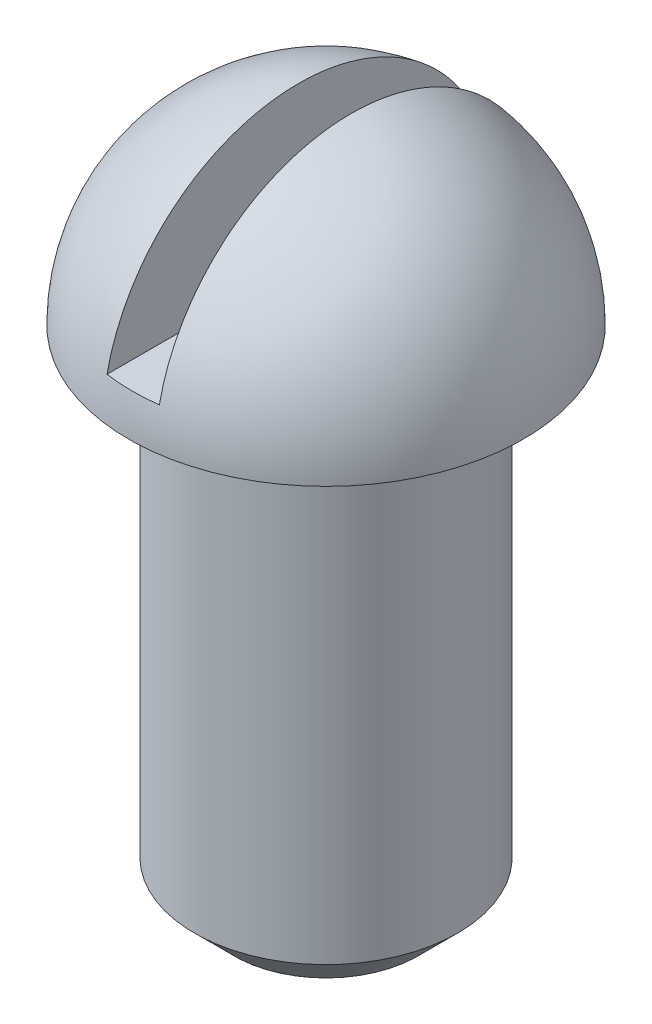
ISO-10303-21;
HEADER;
FILE_DESCRIPTION(('STEP AP214'),'2;1');
FILE_NAME('part.step','',(''),(''),'','','');
FILE_SCHEMA(('AUTOMOTIVE_DESIGN { 1 0 10303 214 1 1 1 1 }'));
ENDSEC;
DATA;
#1=APPLICATION_CONTEXT('core data for automotive mechanical design processes');
#2=APPLICATION_PROTOCOL_DEFINITION('international standard','automotive_design',2000,#1);
#3=PRODUCT_CONTEXT('',#1,'mechanical');
#4=PRODUCT('Part','Part','',(#3));
#5=PRODUCT_RELATED_PRODUCT_CATEGORY('part','',(#4));
#6=PRODUCT_DEFINITION_FORMATION('','',#4);
#7=PRODUCT_DEFINITION_CONTEXT('part definition',#1,'design');
#8=PRODUCT_DEFINITION('design','',#6,#7);
#9=PRODUCT_DEFINITION_SHAPE('','',#8);
#10=(LENGTH_UNIT() NAMED_UNIT(*) SI_UNIT(.MILLI.,.METRE.));
#11=(NAMED_UNIT(*) PLANE_ANGLE_UNIT() SI_UNIT($,.RADIAN.));
#12=(NAMED_UNIT(*) SI_UNIT($,.STERADIAN.) SOLID_ANGLE_UNIT());
#13=UNCERTAINTY_MEASURE_WITH_UNIT(LENGTH_MEASURE(1.E-05),#10,'distance_accuracy_value','');
#14=(GEOMETRIC_REPRESENTATION_CONTEXT(3) GLOBAL_UNCERTAINTY_ASSIGNED_CONTEXT((#13)) GLOBAL_UNIT_ASSIGNED_CONTEXT((#10,
#11,#12)) REPRESENTATION_CONTEXT('',''));
#15=CARTESIAN_POINT('',(0.,0.,0.));
#16=DIRECTION('',(0.,0.,1.));
#17=DIRECTION('',(1.,0.,0.));
#18=AXIS2_PLACEMENT_3D('',#15,#16,#17);
#19=CARTESIAN_POINT('',(-7.,0.,0.));
#20=DIRECTION('',(0.,1.,0.));
#21=DIRECTION('',(0.,0.,1.));
#22=AXIS2_PLACEMENT_3D('',#19,#20,#21);
#23=PLANE('',#22);
#24=CARTESIAN_POINT('',(0.,0.,0.));
#25=DIRECTION('',(0.,-1.,0.));
#26=DIRECTION('',(0.,0.,-1.));
#27=AXIS2_PLACEMENT_3D('',#24,#25,#26);
#28=CIRCLE('',#27,7.);
#29=CARTESIAN_POINT('',(0.,0.,-7.));
#30=VERTEX_POINT('',#29);
#31=EDGE_CURVE('E64',#30,#30,#28,.T.);
#32=ORIENTED_EDGE('',*,*,#31,.T.);
#33=EDGE_LOOP('',(#32));
#34=FACE_BOUND('',#33,.T.);
#35=ADVANCED_FACE('F33',(#34),#23,.F.);
#36=CARTESIAN_POINT('',(0.,3.,0.));
#37=DIRECTION('',(0.,1.,0.));
#38=DIRECTION('',(0.,0.,1.));
#39=AXIS2_PLACEMENT_3D('',#36,#37,#38);
#40=CONICAL_SURFACE('',#39,10.,0.785398163397448);
#41=ORIENTED_EDGE('',*,*,#31,.F.);
#42=EDGE_LOOP('',(#41));
#43=FACE_BOUND('',#42,.T.);
#44=CARTESIAN_POINT('',(0.,3.,0.));
#45=DIRECTION('',(0.,-1.,0.));
#46=DIRECTION('',(0.,0.,-1.));
#47=AXIS2_PLACEMENT_3D('',#44,#45,#46);
#48=CIRCLE('',#47,10.);
#49=CARTESIAN_POINT('',(0.,3.,-10.));
#50=VERTEX_POINT('',#49);
#51=EDGE_CURVE('E75',#50,#50,#48,.T.);
#52=ORIENTED_EDGE('',*,*,#51,.T.);
#53=EDGE_LOOP('',(#52));
#54=FACE_BOUND('',#53,.T.);
#55=ADVANCED_FACE('F94',(#43,#54),#40,.T.);
#56=CARTESIAN_POINT('',(0.,0.,0.));
#57=DIRECTION('',(0.,-1.,0.));
#58=DIRECTION('',(0.,0.,-1.));
#59=AXIS2_PLACEMENT_3D('',#56,#57,#58);
#60=CYLINDRICAL_SURFACE('',#59,10.);
#61=ORIENTED_EDGE('',*,*,#51,.F.);
#62=EDGE_LOOP('',(#61));
#63=FACE_BOUND('',#62,.T.);
#64=CARTESIAN_POINT('',(0.,38.,0.));
#65=DIRECTION('',(0.,-1.,0.));
#66=DIRECTION('',(0.,0.,-1.));
#67=AXIS2_PLACEMENT_3D('',#64,#65,#66);
#68=CIRCLE('',#67,10.);
#69=CARTESIAN_POINT('',(0.,38.,-10.));
#70=VERTEX_POINT('',#69);
#71=EDGE_CURVE('E78',#70,#70,#68,.T.);
#72=ORIENTED_EDGE('',*,*,#71,.T.);
#73=EDGE_LOOP('',(#72));
#74=FACE_BOUND('',#73,.T.);
#75=ADVANCED_FACE('F99',(#63,#74),#60,.T.);
#76=CARTESIAN_POINT('',(-10.,38.,0.));
#77=DIRECTION('',(0.,1.,0.));
#78=DIRECTION('',(0.,0.,1.));
#79=AXIS2_PLACEMENT_3D('',#76,#77,#78);
#80=PLANE('',#79);
#81=ORIENTED_EDGE('',*,*,#71,.F.);
#82=EDGE_LOOP('',(#81));
#83=FACE_BOUND('',#82,.T.);
#84=CARTESIAN_POINT('',(0.,38.,0.));
#85=DIRECTION('',(0.,-1.,0.));
#86=DIRECTION('',(0.,0.,-1.));
#87=AXIS2_PLACEMENT_3D('',#84,#85,#86);
#88=CIRCLE('',#87,15.);
#89=CARTESIAN_POINT('',(0.,38.,-15.));
#90=VERTEX_POINT('',#89);
#91=EDGE_CURVE('E81',#90,#90,#88,.T.);
#92=ORIENTED_EDGE('',*,*,#91,.T.);
#93=EDGE_LOOP('',(#92));
#94=FACE_BOUND('',#93,.T.);
#95=ADVANCED_FACE('F107',(#83,#94),#80,.F.);
#96=CARTESIAN_POINT('',(0.,38.,0.));
#97=DIRECTION('',(0.,-1.,0.));
#98=DIRECTION('',(-1.,0.,0.));
#99=AXIS2_PLACEMENT_3D('',#96,#97,#98);
#100=SPHERICAL_SURFACE('',#99,15.);
#101=CARTESIAN_POINT('',(0.,40.9991362441103,0.));
#102=DIRECTION('',(0.,-1.,0.));
#103=DIRECTION('',(0.,0.,-1.));
#104=AXIS2_PLACEMENT_3D('',#101,#102,#103);
#105=CIRCLE('',#104,14.6971147436925);
#106=CARTESIAN_POINT('',(1.91161891706315,40.9991362441103,14.5722645771064));
#107=VERTEX_POINT('',#106);
#108=CARTESIAN_POINT('',(-2.08838108296061,40.9991362441103,14.5479842672996));
#109=VERTEX_POINT('',#108);
#110=EDGE_CURVE('E40',#107,#109,#105,.T.);
#111=ORIENTED_EDGE('',*,*,#110,.T.);
#112=CARTESIAN_POINT('',(-2.08838108296589,38.0000000000037,0.));
#113=DIRECTION('',(-1.,1.76150266587322E-12,0.));
#114=DIRECTION('',(-1.76150266587322E-12,-1.,0.));
#115=AXIS2_PLACEMENT_3D('',#112,#113,#114);
#116=CIRCLE('',#115,14.8539107460732);
#117=CARTESIAN_POINT('',(-2.08838108296061,40.9991362441103,-14.5479842672996));
#118=VERTEX_POINT('',#117);
#119=EDGE_CURVE('E11',#109,#118,#116,.T.);
#120=ORIENTED_EDGE('',*,*,#119,.T.);
#121=CARTESIAN_POINT('',(1.91161891706315,40.9991362441103,-14.5722645771064));
#122=VERTEX_POINT('',#121);
#123=EDGE_CURVE('E63',#118,#122,#105,.T.);
#124=ORIENTED_EDGE('',*,*,#123,.T.);
#125=CARTESIAN_POINT('',(1.91161891706315,38.,0.));
#126=DIRECTION('',(1.,0.,0.));
#127=DIRECTION('',(0.,0.,-1.));
#128=AXIS2_PLACEMENT_3D('',#125,#126,#127);
#129=CIRCLE('',#128,14.8776917939553);
#130=EDGE_CURVE('E58',#122,#107,#129,.T.);
#131=ORIENTED_EDGE('',*,*,#130,.T.);
#132=EDGE_LOOP('',(#111,#120,#124,#131));
#133=FACE_BOUND('',#132,.T.);
#134=ORIENTED_EDGE('',*,*,#91,.F.);
#135=EDGE_LOOP('',(#134));
#136=FACE_BOUND('',#135,.T.);
#137=ADVANCED_FACE('F70',(#133,#136),#100,.T.);
#138=CARTESIAN_POINT('',(-2.08838108296061,40.9991362441103,-15.));
#139=DIRECTION('',(0.,-1.,0.));
#140=DIRECTION('',(0.,0.,-1.));
#141=AXIS2_PLACEMENT_3D('',#138,#139,#140);
#142=PLANE('',#141);
#143=DIRECTION('',(0.,0.,1.));
#144=VECTOR('',#143,1.);
#145=CARTESIAN_POINT('',(1.91161891706315,40.9991362441103,-15.));
#146=LINE('',#145,#144);
#147=EDGE_CURVE('E46',#122,#107,#146,.T.);
#148=ORIENTED_EDGE('',*,*,#147,.F.);
#149=ORIENTED_EDGE('',*,*,#123,.F.);
#150=DIRECTION('',(0.,0.,1.));
#151=VECTOR('',#150,1.);
#152=CARTESIAN_POINT('',(-2.08838108296061,40.9991362441103,-15.));
#153=LINE('',#152,#151);
#154=EDGE_CURVE('E68',#118,#109,#153,.T.);
#155=ORIENTED_EDGE('',*,*,#154,.T.);
#156=ORIENTED_EDGE('',*,*,#110,.F.);
#157=EDGE_LOOP('',(#148,#149,#155,#156));
#158=FACE_BOUND('',#157,.T.);
#159=ADVANCED_FACE('F67',(#158),#142,.F.);
#160=CARTESIAN_POINT('',(-2.08838108293685,54.4879080244674,-15.));
#161=DIRECTION('',(-1.,1.76150266587322E-12,0.));
#162=DIRECTION('',(-1.76150266587322E-12,-1.,0.));
#163=AXIS2_PLACEMENT_3D('',#160,#161,#162);
#164=PLANE('',#163);
#165=ORIENTED_EDGE('',*,*,#154,.F.);
#166=ORIENTED_EDGE('',*,*,#119,.F.);
#167=EDGE_LOOP('',(#165,#166));
#168=FACE_BOUND('',#167,.T.);
#169=ADVANCED_FACE('F84',(#168),#164,.F.);
#170=CARTESIAN_POINT('',(1.91161891706315,40.9991362441103,-15.));
#171=DIRECTION('',(1.,0.,0.));
#172=DIRECTION('',(0.,0.,-1.));
#173=AXIS2_PLACEMENT_3D('',#170,#171,#172);
#174=PLANE('',#173);
#175=ORIENTED_EDGE('',*,*,#147,.T.);
#176=ORIENTED_EDGE('',*,*,#130,.F.);
#177=EDGE_LOOP('',(#175,#176));
#178=FACE_BOUND('',#177,.T.);
#179=ADVANCED_FACE('F59',(#178),#174,.F.);
#180=CLOSED_SHELL('',(#35,#55,#75,#95,#137,#159,#169,#179));
#181=MANIFOLD_SOLID_BREP('B2',#180);
#182=ADVANCED_BREP_SHAPE_REPRESENTATION('',(#18,#181),#14);
#183=SHAPE_DEFINITION_REPRESENTATION(#9,#182);
ENDSEC;
END-ISO-10303-21;
